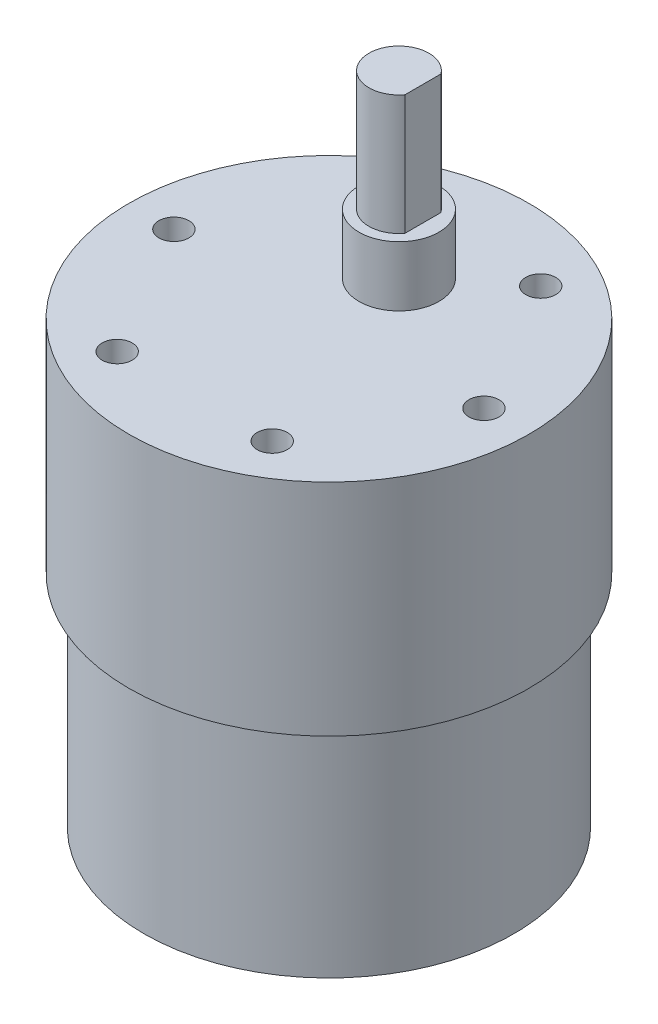
ISO-10303-21;
HEADER;
FILE_DESCRIPTION(('STEP AP214'),'2;1');
FILE_NAME('part.step','',(''),(''),'','','');
FILE_SCHEMA(('AUTOMOTIVE_DESIGN { 1 0 10303 214 1 1 1 1 }'));
ENDSEC;
DATA;
#1=APPLICATION_CONTEXT('core data for automotive mechanical design processes');
#2=APPLICATION_PROTOCOL_DEFINITION('international standard','automotive_design',2000,#1);
#3=PRODUCT_CONTEXT('',#1,'mechanical');
#4=PRODUCT('Part','Part','',(#3));
#5=PRODUCT_RELATED_PRODUCT_CATEGORY('part','',(#4));
#6=PRODUCT_DEFINITION_FORMATION('','',#4);
#7=PRODUCT_DEFINITION_CONTEXT('part definition',#1,'design');
#8=PRODUCT_DEFINITION('design','',#6,#7);
#9=PRODUCT_DEFINITION_SHAPE('','',#8);
#10=(LENGTH_UNIT() NAMED_UNIT(*) SI_UNIT(.MILLI.,.METRE.));
#11=(NAMED_UNIT(*) PLANE_ANGLE_UNIT() SI_UNIT($,.RADIAN.));
#12=(NAMED_UNIT(*) SI_UNIT($,.STERADIAN.) SOLID_ANGLE_UNIT());
#13=UNCERTAINTY_MEASURE_WITH_UNIT(LENGTH_MEASURE(1.E-05),#10,'distance_accuracy_value','');
#14=(GEOMETRIC_REPRESENTATION_CONTEXT(3) GLOBAL_UNCERTAINTY_ASSIGNED_CONTEXT((#13)) GLOBAL_UNIT_ASSIGNED_CONTEXT((#10,
#11,#12)) REPRESENTATION_CONTEXT('',''));
#15=CARTESIAN_POINT('',(0.,0.,0.));
#16=DIRECTION('',(0.,0.,1.));
#17=DIRECTION('',(1.,0.,0.));
#18=AXIS2_PLACEMENT_3D('',#15,#16,#17);
#19=CARTESIAN_POINT('',(0.,22.,0.));
#20=DIRECTION('',(0.,-1.,0.));
#21=DIRECTION('',(0.,0.,-1.));
#22=AXIS2_PLACEMENT_3D('',#19,#20,#21);
#23=CYLINDRICAL_SURFACE('',#22,18.5);
#24=CARTESIAN_POINT('',(0.,22.,0.));
#25=DIRECTION('',(0.,1.,0.));
#26=DIRECTION('',(0.,0.,1.));
#27=AXIS2_PLACEMENT_3D('',#24,#25,#26);
#28=CIRCLE('',#27,18.5);
#29=CARTESIAN_POINT('',(0.,22.,18.5));
#30=VERTEX_POINT('',#29);
#31=EDGE_CURVE('E11',#30,#30,#28,.T.);
#32=ORIENTED_EDGE('',*,*,#31,.F.);
#33=EDGE_LOOP('',(#32));
#34=FACE_BOUND('',#33,.T.);
#35=CARTESIAN_POINT('',(0.,0.,0.));
#36=DIRECTION('',(0.,1.,0.));
#37=DIRECTION('',(0.,0.,1.));
#38=AXIS2_PLACEMENT_3D('',#35,#36,#37);
#39=CIRCLE('',#38,18.5);
#40=CARTESIAN_POINT('',(0.,0.,18.5));
#41=VERTEX_POINT('',#40);
#42=EDGE_CURVE('E42',#41,#41,#39,.T.);
#43=ORIENTED_EDGE('',*,*,#42,.T.);
#44=EDGE_LOOP('',(#43));
#45=FACE_BOUND('',#44,.T.);
#46=ADVANCED_FACE('F39',(#34,#45),#23,.T.);
#47=CARTESIAN_POINT('',(0.,0.,0.));
#48=DIRECTION('',(0.,1.,0.));
#49=DIRECTION('',(0.,0.,1.));
#50=AXIS2_PLACEMENT_3D('',#47,#48,#49);
#51=PLANE('',#50);
#52=ORIENTED_EDGE('',*,*,#42,.F.);
#53=EDGE_LOOP('',(#52));
#54=FACE_BOUND('',#53,.T.);
#55=ADVANCED_FACE('F174',(#54),#51,.F.);
#56=CARTESIAN_POINT('',(0.,44.,0.));
#57=DIRECTION('',(0.,-1.,0.));
#58=DIRECTION('',(0.,0.,-1.));
#59=AXIS2_PLACEMENT_3D('',#56,#57,#58);
#60=CYLINDRICAL_SURFACE('',#59,20.);
#61=CARTESIAN_POINT('',(0.,44.,0.));
#62=DIRECTION('',(0.,1.,0.));
#63=DIRECTION('',(0.,0.,1.));
#64=AXIS2_PLACEMENT_3D('',#61,#62,#63);
#65=CIRCLE('',#64,20.);
#66=CARTESIAN_POINT('',(0.,44.,20.));
#67=VERTEX_POINT('',#66);
#68=EDGE_CURVE('E147',#67,#67,#65,.T.);
#69=ORIENTED_EDGE('',*,*,#68,.F.);
#70=EDGE_LOOP('',(#69));
#71=FACE_BOUND('',#70,.T.);
#72=CARTESIAN_POINT('',(0.,22.,0.));
#73=DIRECTION('',(0.,1.,0.));
#74=DIRECTION('',(0.,0.,1.));
#75=AXIS2_PLACEMENT_3D('',#72,#73,#74);
#76=CIRCLE('',#75,20.);
#77=CARTESIAN_POINT('',(0.,22.,20.));
#78=VERTEX_POINT('',#77);
#79=EDGE_CURVE('E143',#78,#78,#76,.T.);
#80=ORIENTED_EDGE('',*,*,#79,.T.);
#81=EDGE_LOOP('',(#80));
#82=FACE_BOUND('',#81,.T.);
#83=ADVANCED_FACE('F155',(#71,#82),#60,.T.);
#84=CARTESIAN_POINT('',(0.,44.,0.));
#85=DIRECTION('',(0.,1.,0.));
#86=DIRECTION('',(0.,0.,1.));
#87=AXIS2_PLACEMENT_3D('',#84,#85,#86);
#88=PLANE('',#87);
#89=CARTESIAN_POINT('',(0.,44.,-7.));
#90=DIRECTION('',(0.,1.,0.));
#91=DIRECTION('',(0.,0.,1.));
#92=AXIS2_PLACEMENT_3D('',#89,#90,#91);
#93=CIRCLE('',#92,4.);
#94=CARTESIAN_POINT('',(0.,44.,-3.));
#95=VERTEX_POINT('',#94);
#96=EDGE_CURVE('E87',#95,#95,#93,.T.);
#97=ORIENTED_EDGE('',*,*,#96,.F.);
#98=EDGE_LOOP('',(#97));
#99=FACE_BOUND('',#98,.T.);
#100=CARTESIAN_POINT('',(7.75,44.,-13.4233937586588));
#101=DIRECTION('',(0.,1.,0.));
#102=DIRECTION('',(0.,0.,1.));
#103=AXIS2_PLACEMENT_3D('',#100,#101,#102);
#104=CIRCLE('',#103,1.5);
#105=CARTESIAN_POINT('',(7.75,44.,-11.9233937586588));
#106=VERTEX_POINT('',#105);
#107=EDGE_CURVE('E95',#106,#106,#104,.T.);
#108=ORIENTED_EDGE('',*,*,#107,.F.);
#109=EDGE_LOOP('',(#108));
#110=FACE_BOUND('',#109,.T.);
#111=CARTESIAN_POINT('',(15.5,44.,0.));
#112=DIRECTION('',(0.,1.,0.));
#113=DIRECTION('',(0.,0.,1.));
#114=AXIS2_PLACEMENT_3D('',#111,#112,#113);
#115=CIRCLE('',#114,1.5);
#116=CARTESIAN_POINT('',(15.5,44.,1.5));
#117=VERTEX_POINT('',#116);
#118=EDGE_CURVE('E128',#117,#117,#115,.T.);
#119=ORIENTED_EDGE('',*,*,#118,.F.);
#120=EDGE_LOOP('',(#119));
#121=FACE_BOUND('',#120,.T.);
#122=CARTESIAN_POINT('',(7.75,44.,13.4233937586588));
#123=DIRECTION('',(0.,1.,0.));
#124=DIRECTION('',(0.,0.,1.));
#125=AXIS2_PLACEMENT_3D('',#122,#123,#124);
#126=CIRCLE('',#125,1.5);
#127=CARTESIAN_POINT('',(7.75,44.,14.9233937586588));
#128=VERTEX_POINT('',#127);
#129=EDGE_CURVE('E120',#128,#128,#126,.T.);
#130=ORIENTED_EDGE('',*,*,#129,.F.);
#131=EDGE_LOOP('',(#130));
#132=FACE_BOUND('',#131,.T.);
#133=CARTESIAN_POINT('',(-7.75,44.,13.4233937586588));
#134=DIRECTION('',(0.,1.,0.));
#135=DIRECTION('',(0.,0.,1.));
#136=AXIS2_PLACEMENT_3D('',#133,#134,#135);
#137=CIRCLE('',#136,1.5);
#138=CARTESIAN_POINT('',(-7.75,44.,14.9233937586588));
#139=VERTEX_POINT('',#138);
#140=EDGE_CURVE('E112',#139,#139,#137,.T.);
#141=ORIENTED_EDGE('',*,*,#140,.F.);
#142=EDGE_LOOP('',(#141));
#143=FACE_BOUND('',#142,.T.);
#144=CARTESIAN_POINT('',(-15.5,44.,0.));
#145=DIRECTION('',(0.,1.,0.));
#146=DIRECTION('',(0.,0.,1.));
#147=AXIS2_PLACEMENT_3D('',#144,#145,#146);
#148=CIRCLE('',#147,1.5);
#149=CARTESIAN_POINT('',(-15.5,44.,1.5));
#150=VERTEX_POINT('',#149);
#151=EDGE_CURVE('E104',#150,#150,#148,.T.);
#152=ORIENTED_EDGE('',*,*,#151,.F.);
#153=EDGE_LOOP('',(#152));
#154=FACE_BOUND('',#153,.T.);
#155=CARTESIAN_POINT('',(-7.75,44.,-13.4233937586588));
#156=DIRECTION('',(0.,1.,0.));
#157=DIRECTION('',(0.,0.,1.));
#158=AXIS2_PLACEMENT_3D('',#155,#156,#157);
#159=CIRCLE('',#158,1.5);
#160=CARTESIAN_POINT('',(-7.75,44.,-11.9233937586588));
#161=VERTEX_POINT('',#160);
#162=EDGE_CURVE('E103',#161,#161,#159,.T.);
#163=ORIENTED_EDGE('',*,*,#162,.F.);
#164=EDGE_LOOP('',(#163));
#165=FACE_BOUND('',#164,.T.);
#166=ORIENTED_EDGE('',*,*,#68,.T.);
#167=EDGE_LOOP('',(#166));
#168=FACE_BOUND('',#167,.T.);
#169=ADVANCED_FACE('F160',(#99,#110,#121,#132,#143,#154,#165,#168),#88,.T.);
#170=CARTESIAN_POINT('',(0.,22.,0.));
#171=DIRECTION('',(0.,1.,0.));
#172=DIRECTION('',(0.,0.,1.));
#173=AXIS2_PLACEMENT_3D('',#170,#171,#172);
#174=PLANE('',#173);
#175=ORIENTED_EDGE('',*,*,#31,.T.);
#176=EDGE_LOOP('',(#175));
#177=FACE_BOUND('',#176,.T.);
#178=ORIENTED_EDGE('',*,*,#79,.F.);
#179=EDGE_LOOP('',(#178));
#180=FACE_BOUND('',#179,.T.);
#181=ADVANCED_FACE('F157',(#177,#180),#174,.F.);
#182=CARTESIAN_POINT('',(-7.75,39.,-13.4233937586588));
#183=DIRECTION('',(0.,1.,0.));
#184=DIRECTION('',(0.,0.,1.));
#185=AXIS2_PLACEMENT_3D('',#182,#183,#184);
#186=CYLINDRICAL_SURFACE('',#185,1.5);
#187=CARTESIAN_POINT('',(-7.75,39.,-13.4233937586588));
#188=DIRECTION('',(0.,1.,0.));
#189=DIRECTION('',(0.,0.,1.));
#190=AXIS2_PLACEMENT_3D('',#187,#188,#189);
#191=CIRCLE('',#190,1.5);
#192=CARTESIAN_POINT('',(-7.75,39.,-11.9233937586588));
#193=VERTEX_POINT('',#192);
#194=EDGE_CURVE('E139',#193,#193,#191,.T.);
#195=ORIENTED_EDGE('',*,*,#194,.F.);
#196=EDGE_LOOP('',(#195));
#197=FACE_BOUND('',#196,.T.);
#198=ORIENTED_EDGE('',*,*,#162,.T.);
#199=EDGE_LOOP('',(#198));
#200=FACE_BOUND('',#199,.T.);
#201=ADVANCED_FACE('F159',(#197,#200),#186,.F.);
#202=CARTESIAN_POINT('',(-7.75,39.,-13.4233937586588));
#203=DIRECTION('',(0.,1.,0.));
#204=DIRECTION('',(0.,0.,1.));
#205=AXIS2_PLACEMENT_3D('',#202,#203,#204);
#206=PLANE('',#205);
#207=ORIENTED_EDGE('',*,*,#194,.T.);
#208=EDGE_LOOP('',(#207));
#209=FACE_BOUND('',#208,.T.);
#210=ADVANCED_FACE('F167',(#209),#206,.T.);
#211=CARTESIAN_POINT('',(-15.5,39.,0.));
#212=DIRECTION('',(0.,1.,0.));
#213=DIRECTION('',(0.,0.,1.));
#214=AXIS2_PLACEMENT_3D('',#211,#212,#213);
#215=CYLINDRICAL_SURFACE('',#214,1.5);
#216=CARTESIAN_POINT('',(-15.5,39.,0.));
#217=DIRECTION('',(0.,1.,0.));
#218=DIRECTION('',(0.,0.,1.));
#219=AXIS2_PLACEMENT_3D('',#216,#217,#218);
#220=CIRCLE('',#219,1.5);
#221=CARTESIAN_POINT('',(-15.5,39.,1.5));
#222=VERTEX_POINT('',#221);
#223=EDGE_CURVE('E99',#222,#222,#220,.T.);
#224=ORIENTED_EDGE('',*,*,#223,.F.);
#225=EDGE_LOOP('',(#224));
#226=FACE_BOUND('',#225,.T.);
#227=ORIENTED_EDGE('',*,*,#151,.T.);
#228=EDGE_LOOP('',(#227));
#229=FACE_BOUND('',#228,.T.);
#230=ADVANCED_FACE('F256',(#226,#229),#215,.F.);
#231=CARTESIAN_POINT('',(-15.5,39.,0.));
#232=DIRECTION('',(0.,1.,0.));
#233=DIRECTION('',(0.,0.,1.));
#234=AXIS2_PLACEMENT_3D('',#231,#232,#233);
#235=PLANE('',#234);
#236=ORIENTED_EDGE('',*,*,#223,.T.);
#237=EDGE_LOOP('',(#236));
#238=FACE_BOUND('',#237,.T.);
#239=ADVANCED_FACE('F252',(#238),#235,.T.);
#240=CARTESIAN_POINT('',(-7.75,39.,13.4233937586588));
#241=DIRECTION('',(0.,1.,0.));
#242=DIRECTION('',(0.,0.,1.));
#243=AXIS2_PLACEMENT_3D('',#240,#241,#242);
#244=CYLINDRICAL_SURFACE('',#243,1.5);
#245=CARTESIAN_POINT('',(-7.75,39.,13.4233937586588));
#246=DIRECTION('',(0.,1.,0.));
#247=DIRECTION('',(0.,0.,1.));
#248=AXIS2_PLACEMENT_3D('',#245,#246,#247);
#249=CIRCLE('',#248,1.5);
#250=CARTESIAN_POINT('',(-7.75,39.,14.9233937586588));
#251=VERTEX_POINT('',#250);
#252=EDGE_CURVE('E108',#251,#251,#249,.T.);
#253=ORIENTED_EDGE('',*,*,#252,.F.);
#254=EDGE_LOOP('',(#253));
#255=FACE_BOUND('',#254,.T.);
#256=ORIENTED_EDGE('',*,*,#140,.T.);
#257=EDGE_LOOP('',(#256));
#258=FACE_BOUND('',#257,.T.);
#259=ADVANCED_FACE('F255',(#255,#258),#244,.F.);
#260=CARTESIAN_POINT('',(-7.75,39.,13.4233937586588));
#261=DIRECTION('',(0.,1.,0.));
#262=DIRECTION('',(0.,0.,1.));
#263=AXIS2_PLACEMENT_3D('',#260,#261,#262);
#264=PLANE('',#263);
#265=ORIENTED_EDGE('',*,*,#252,.T.);
#266=EDGE_LOOP('',(#265));
#267=FACE_BOUND('',#266,.T.);
#268=ADVANCED_FACE('F261',(#267),#264,.T.);
#269=CARTESIAN_POINT('',(7.75,39.,13.4233937586588));
#270=DIRECTION('',(0.,1.,0.));
#271=DIRECTION('',(0.,0.,1.));
#272=AXIS2_PLACEMENT_3D('',#269,#270,#271);
#273=CYLINDRICAL_SURFACE('',#272,1.5);
#274=CARTESIAN_POINT('',(7.75,39.,13.4233937586588));
#275=DIRECTION('',(0.,1.,0.));
#276=DIRECTION('',(0.,0.,1.));
#277=AXIS2_PLACEMENT_3D('',#274,#275,#276);
#278=CIRCLE('',#277,1.5);
#279=CARTESIAN_POINT('',(7.75,39.,14.9233937586588));
#280=VERTEX_POINT('',#279);
#281=EDGE_CURVE('E116',#280,#280,#278,.T.);
#282=ORIENTED_EDGE('',*,*,#281,.F.);
#283=EDGE_LOOP('',(#282));
#284=FACE_BOUND('',#283,.T.);
#285=ORIENTED_EDGE('',*,*,#129,.T.);
#286=EDGE_LOOP('',(#285));
#287=FACE_BOUND('',#286,.T.);
#288=ADVANCED_FACE('F264',(#284,#287),#273,.F.);
#289=CARTESIAN_POINT('',(7.75,39.,13.4233937586588));
#290=DIRECTION('',(0.,1.,0.));
#291=DIRECTION('',(0.,0.,1.));
#292=AXIS2_PLACEMENT_3D('',#289,#290,#291);
#293=PLANE('',#292);
#294=ORIENTED_EDGE('',*,*,#281,.T.);
#295=EDGE_LOOP('',(#294));
#296=FACE_BOUND('',#295,.T.);
#297=ADVANCED_FACE('F269',(#296),#293,.T.);
#298=CARTESIAN_POINT('',(15.5,39.,0.));
#299=DIRECTION('',(0.,1.,0.));
#300=DIRECTION('',(0.,0.,1.));
#301=AXIS2_PLACEMENT_3D('',#298,#299,#300);
#302=CYLINDRICAL_SURFACE('',#301,1.5);
#303=CARTESIAN_POINT('',(15.5,39.,0.));
#304=DIRECTION('',(0.,1.,0.));
#305=DIRECTION('',(0.,0.,1.));
#306=AXIS2_PLACEMENT_3D('',#303,#304,#305);
#307=CIRCLE('',#306,1.5);
#308=CARTESIAN_POINT('',(15.5,39.,1.5));
#309=VERTEX_POINT('',#308);
#310=EDGE_CURVE('E124',#309,#309,#307,.T.);
#311=ORIENTED_EDGE('',*,*,#310,.F.);
#312=EDGE_LOOP('',(#311));
#313=FACE_BOUND('',#312,.T.);
#314=ORIENTED_EDGE('',*,*,#118,.T.);
#315=EDGE_LOOP('',(#314));
#316=FACE_BOUND('',#315,.T.);
#317=ADVANCED_FACE('F272',(#313,#316),#302,.F.);
#318=CARTESIAN_POINT('',(15.5,39.,0.));
#319=DIRECTION('',(0.,1.,0.));
#320=DIRECTION('',(0.,0.,1.));
#321=AXIS2_PLACEMENT_3D('',#318,#319,#320);
#322=PLANE('',#321);
#323=ORIENTED_EDGE('',*,*,#310,.T.);
#324=EDGE_LOOP('',(#323));
#325=FACE_BOUND('',#324,.T.);
#326=ADVANCED_FACE('F277',(#325),#322,.T.);
#327=CARTESIAN_POINT('',(7.75,39.,-13.4233937586588));
#328=DIRECTION('',(0.,1.,0.));
#329=DIRECTION('',(0.,0.,1.));
#330=AXIS2_PLACEMENT_3D('',#327,#328,#329);
#331=CYLINDRICAL_SURFACE('',#330,1.5);
#332=CARTESIAN_POINT('',(7.75,39.,-13.4233937586588));
#333=DIRECTION('',(0.,1.,0.));
#334=DIRECTION('',(0.,0.,1.));
#335=AXIS2_PLACEMENT_3D('',#332,#333,#334);
#336=CIRCLE('',#335,1.5);
#337=CARTESIAN_POINT('',(7.75,39.,-11.9233937586588));
#338=VERTEX_POINT('',#337);
#339=EDGE_CURVE('E132',#338,#338,#336,.T.);
#340=ORIENTED_EDGE('',*,*,#339,.F.);
#341=EDGE_LOOP('',(#340));
#342=FACE_BOUND('',#341,.T.);
#343=ORIENTED_EDGE('',*,*,#107,.T.);
#344=EDGE_LOOP('',(#343));
#345=FACE_BOUND('',#344,.T.);
#346=ADVANCED_FACE('F280',(#342,#345),#331,.F.);
#347=CARTESIAN_POINT('',(7.75,39.,-13.4233937586588));
#348=DIRECTION('',(0.,1.,0.));
#349=DIRECTION('',(0.,0.,1.));
#350=AXIS2_PLACEMENT_3D('',#347,#348,#349);
#351=PLANE('',#350);
#352=ORIENTED_EDGE('',*,*,#339,.T.);
#353=EDGE_LOOP('',(#352));
#354=FACE_BOUND('',#353,.T.);
#355=ADVANCED_FACE('F204',(#354),#351,.T.);
#356=CARTESIAN_POINT('',(0.,50.,-7.));
#357=DIRECTION('',(0.,-1.,0.));
#358=DIRECTION('',(0.,0.,-1.));
#359=AXIS2_PLACEMENT_3D('',#356,#357,#358);
#360=CYLINDRICAL_SURFACE('',#359,4.);
#361=CARTESIAN_POINT('',(0.,50.,-7.));
#362=DIRECTION('',(0.,1.,0.));
#363=DIRECTION('',(0.,0.,1.));
#364=AXIS2_PLACEMENT_3D('',#361,#362,#363);
#365=CIRCLE('',#364,4.);
#366=CARTESIAN_POINT('',(0.,50.,-3.));
#367=VERTEX_POINT('',#366);
#368=EDGE_CURVE('E91',#367,#367,#365,.T.);
#369=ORIENTED_EDGE('',*,*,#368,.F.);
#370=EDGE_LOOP('',(#369));
#371=FACE_BOUND('',#370,.T.);
#372=ORIENTED_EDGE('',*,*,#96,.T.);
#373=EDGE_LOOP('',(#372));
#374=FACE_BOUND('',#373,.T.);
#375=ADVANCED_FACE('F209',(#371,#374),#360,.T.);
#376=CARTESIAN_POINT('',(0.,50.,-7.));
#377=DIRECTION('',(0.,1.,0.));
#378=DIRECTION('',(0.,0.,1.));
#379=AXIS2_PLACEMENT_3D('',#376,#377,#378);
#380=PLANE('',#379);
#381=CARTESIAN_POINT('',(0.,50.,-7.));
#382=DIRECTION('',(0.,1.,0.));
#383=DIRECTION('',(0.,0.,1.));
#384=AXIS2_PLACEMENT_3D('',#381,#382,#383);
#385=CIRCLE('',#384,3.);
#386=CARTESIAN_POINT('',(2.4,50.,-8.8));
#387=VERTEX_POINT('',#386);
#388=CARTESIAN_POINT('',(2.4,50.,-5.2));
#389=VERTEX_POINT('',#388);
#390=EDGE_CURVE('E66',#387,#389,#385,.T.);
#391=ORIENTED_EDGE('',*,*,#390,.F.);
#392=DIRECTION('',(0.,0.,-1.));
#393=VECTOR('',#392,1.);
#394=CARTESIAN_POINT('',(2.4,50.,-8.8));
#395=LINE('',#394,#393);
#396=EDGE_CURVE('E53',#389,#387,#395,.T.);
#397=ORIENTED_EDGE('',*,*,#396,.F.);
#398=EDGE_LOOP('',(#391,#397));
#399=FACE_BOUND('',#398,.T.);
#400=ORIENTED_EDGE('',*,*,#368,.T.);
#401=EDGE_LOOP('',(#400));
#402=FACE_BOUND('',#401,.T.);
#403=ADVANCED_FACE('F67',(#399,#402),#380,.T.);
#404=CARTESIAN_POINT('',(0.,62.,-7.));
#405=DIRECTION('',(0.,-1.,0.));
#406=DIRECTION('',(0.,0.,-1.));
#407=AXIS2_PLACEMENT_3D('',#404,#405,#406);
#408=CYLINDRICAL_SURFACE('',#407,3.);
#409=ORIENTED_EDGE('',*,*,#390,.T.);
#410=DIRECTION('',(0.,-1.,0.));
#411=VECTOR('',#410,1.);
#412=CARTESIAN_POINT('',(2.4,62.,-5.2));
#413=LINE('',#412,#411);
#414=CARTESIAN_POINT('',(2.4,62.,-5.2));
#415=VERTEX_POINT('',#414);
#416=EDGE_CURVE('E78',#415,#389,#413,.T.);
#417=ORIENTED_EDGE('',*,*,#416,.F.);
#418=CARTESIAN_POINT('',(0.,62.,-7.));
#419=DIRECTION('',(0.,1.,0.));
#420=DIRECTION('',(0.,0.,1.));
#421=AXIS2_PLACEMENT_3D('',#418,#419,#420);
#422=CIRCLE('',#421,3.);
#423=CARTESIAN_POINT('',(2.4,62.,-8.8));
#424=VERTEX_POINT('',#423);
#425=EDGE_CURVE('E80',#424,#415,#422,.T.);
#426=ORIENTED_EDGE('',*,*,#425,.F.);
#427=DIRECTION('',(0.,-1.,0.));
#428=VECTOR('',#427,1.);
#429=CARTESIAN_POINT('',(2.4,62.,-8.8));
#430=LINE('',#429,#428);
#431=EDGE_CURVE('E76',#424,#387,#430,.T.);
#432=ORIENTED_EDGE('',*,*,#431,.T.);
#433=EDGE_LOOP('',(#409,#417,#426,#432));
#434=FACE_BOUND('',#433,.T.);
#435=ADVANCED_FACE('F82',(#434),#408,.T.);
#436=CARTESIAN_POINT('',(2.4,62.,-8.8));
#437=DIRECTION('',(-1.,0.,0.));
#438=DIRECTION('',(0.,0.,1.));
#439=AXIS2_PLACEMENT_3D('',#436,#437,#438);
#440=PLANE('',#439);
#441=ORIENTED_EDGE('',*,*,#396,.T.);
#442=ORIENTED_EDGE('',*,*,#431,.F.);
#443=DIRECTION('',(0.,0.,-1.));
#444=VECTOR('',#443,1.);
#445=CARTESIAN_POINT('',(2.4,62.,-8.8));
#446=LINE('',#445,#444);
#447=EDGE_CURVE('E61',#415,#424,#446,.T.);
#448=ORIENTED_EDGE('',*,*,#447,.F.);
#449=ORIENTED_EDGE('',*,*,#416,.T.);
#450=EDGE_LOOP('',(#441,#442,#448,#449));
#451=FACE_BOUND('',#450,.T.);
#452=ADVANCED_FACE('F75',(#451),#440,.F.);
#453=CARTESIAN_POINT('',(0.,62.,-7.));
#454=DIRECTION('',(0.,1.,0.));
#455=DIRECTION('',(0.,0.,1.));
#456=AXIS2_PLACEMENT_3D('',#453,#454,#455);
#457=PLANE('',#456);
#458=ORIENTED_EDGE('',*,*,#425,.T.);
#459=ORIENTED_EDGE('',*,*,#447,.T.);
#460=EDGE_LOOP('',(#458,#459));
#461=FACE_BOUND('',#460,.T.);
#462=ADVANCED_FACE('F239',(#461),#457,.T.);
#463=CLOSED_SHELL('',(#46,#55,#83,#169,#181,#201,#210,#230,#239,#259,#268,#288,#297,#317,#326,
#346,#355,#375,#403,#435,#452,#462));
#464=MANIFOLD_SOLID_BREP('B2',#463);
#465=ADVANCED_BREP_SHAPE_REPRESENTATION('',(#18,#464),#14);
#466=SHAPE_DEFINITION_REPRESENTATION(#9,#465);
ENDSEC;
END-ISO-10303-21;
